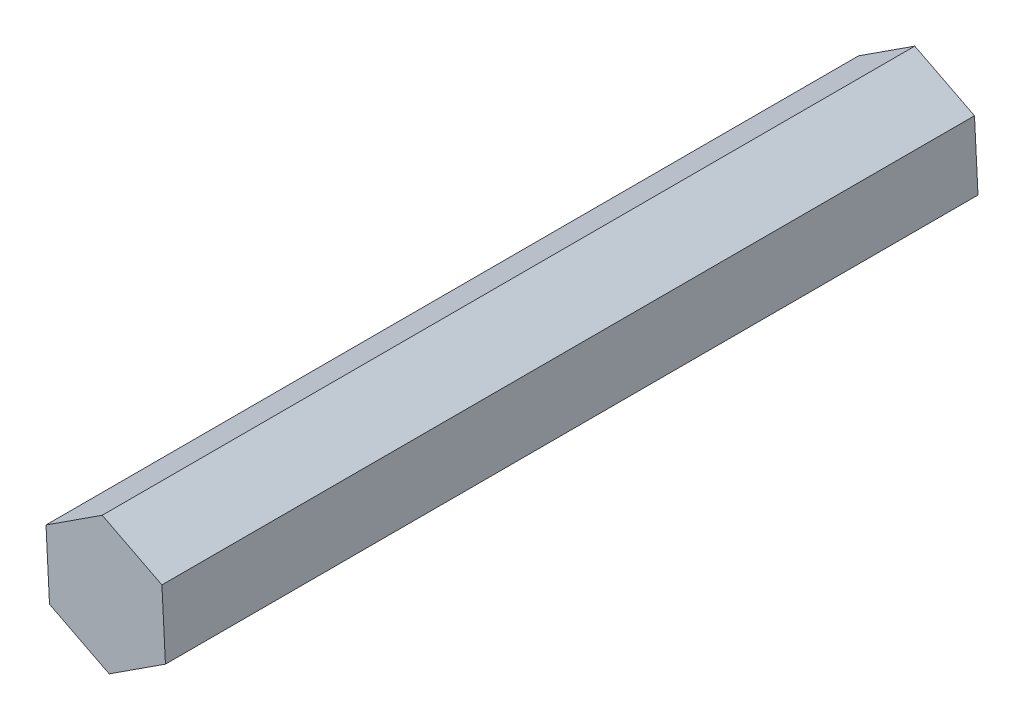
ISO-10303-21;
HEADER;
FILE_DESCRIPTION(('STEP AP214'),'2;1');
FILE_NAME('part.step','',(''),(''),'','','');
FILE_SCHEMA(('AUTOMOTIVE_DESIGN { 1 0 10303 214 1 1 1 1 }'));
ENDSEC;
DATA;
#1=APPLICATION_CONTEXT('core data for automotive mechanical design processes');
#2=APPLICATION_PROTOCOL_DEFINITION('international standard','automotive_design',2000,#1);
#3=PRODUCT_CONTEXT('',#1,'mechanical');
#4=PRODUCT('Part','Part','',(#3));
#5=PRODUCT_RELATED_PRODUCT_CATEGORY('part','',(#4));
#6=PRODUCT_DEFINITION_FORMATION('','',#4);
#7=PRODUCT_DEFINITION_CONTEXT('part definition',#1,'design');
#8=PRODUCT_DEFINITION('design','',#6,#7);
#9=PRODUCT_DEFINITION_SHAPE('','',#8);
#10=(LENGTH_UNIT() NAMED_UNIT(*) SI_UNIT(.MILLI.,.METRE.));
#11=(NAMED_UNIT(*) PLANE_ANGLE_UNIT() SI_UNIT($,.RADIAN.));
#12=(NAMED_UNIT(*) SI_UNIT($,.STERADIAN.) SOLID_ANGLE_UNIT());
#13=UNCERTAINTY_MEASURE_WITH_UNIT(LENGTH_MEASURE(1.E-05),#10,'distance_accuracy_value','');
#14=(GEOMETRIC_REPRESENTATION_CONTEXT(3) GLOBAL_UNCERTAINTY_ASSIGNED_CONTEXT((#13)) GLOBAL_UNIT_ASSIGNED_CONTEXT((#10,
#11,#12)) REPRESENTATION_CONTEXT('',''));
#15=CARTESIAN_POINT('',(0.,0.,0.));
#16=DIRECTION('',(0.,0.,1.));
#17=DIRECTION('',(1.,0.,0.));
#18=AXIS2_PLACEMENT_3D('',#15,#16,#17);
#19=CARTESIAN_POINT('',(-0.383222680415475,7.32232706935087,88.9));
#20=DIRECTION('',(0.544579155708624,-0.838709450982688,0.));
#21=DIRECTION('',(0.838709450982688,0.544579155708624,0.));
#22=AXIS2_PLACEMENT_3D('',#19,#20,#21);
#23=PLANE('',#22);
#24=DIRECTION('',(-0.838709450982688,-0.544579155708624,0.));
#25=VECTOR('',#24,1.);
#26=CARTESIAN_POINT('',(-0.383222680415475,7.32232706935087,0.));
#27=LINE('',#26,#25);
#28=CARTESIAN_POINT('',(-0.383222680415475,7.32232706935087,0.));
#29=VERTEX_POINT('',#28);
#30=CARTESIAN_POINT('',(-6.53293259708405,3.32928295812927,0.));
#31=VERTEX_POINT('',#30);
#32=EDGE_CURVE('E116',#29,#31,#27,.T.);
#33=ORIENTED_EDGE('',*,*,#32,.T.);
#34=DIRECTION('',(0.,0.,-1.));
#35=VECTOR('',#34,1.);
#36=CARTESIAN_POINT('',(-6.53293259708405,3.32928295812927,88.9));
#37=LINE('',#36,#35);
#38=CARTESIAN_POINT('',(-6.53293259708405,3.32928295812927,88.9));
#39=VERTEX_POINT('',#38);
#40=EDGE_CURVE('E11',#39,#31,#37,.T.);
#41=ORIENTED_EDGE('',*,*,#40,.F.);
#42=DIRECTION('',(-0.838709450982688,-0.544579155708624,0.));
#43=VECTOR('',#42,1.);
#44=CARTESIAN_POINT('',(-0.383222680415475,7.32232706935087,88.9));
#45=LINE('',#44,#43);
#46=CARTESIAN_POINT('',(-0.383222680415475,7.32232706935087,88.9));
#47=VERTEX_POINT('',#46);
#48=EDGE_CURVE('E126',#47,#39,#45,.T.);
#49=ORIENTED_EDGE('',*,*,#48,.F.);
#50=DIRECTION('',(0.,0.,-1.));
#51=VECTOR('',#50,1.);
#52=CARTESIAN_POINT('',(-0.383222680415475,7.32232706935087,88.9));
#53=LINE('',#52,#51);
#54=EDGE_CURVE('E112',#47,#29,#53,.T.);
#55=ORIENTED_EDGE('',*,*,#54,.T.);
#56=EDGE_LOOP('',(#33,#41,#49,#55));
#57=FACE_BOUND('',#56,.T.);
#58=ADVANCED_FACE('F32',(#57),#23,.F.);
#59=CARTESIAN_POINT('',(-6.53293259708405,3.32928295812927,88.9));
#60=DIRECTION('',(0.998633268799419,0.0522646577238061,0.));
#61=DIRECTION('',(-0.0522646577238061,0.998633268799419,0.));
#62=AXIS2_PLACEMENT_3D('',#59,#60,#61);
#63=PLANE('',#62);
#64=DIRECTION('',(0.0522646577238061,-0.998633268799419,0.));
#65=VECTOR('',#64,1.);
#66=CARTESIAN_POINT('',(-6.53293259708405,3.32928295812927,0.));
#67=LINE('',#66,#65);
#68=CARTESIAN_POINT('',(-6.14970991666858,-3.9930441112216,0.));
#69=VERTEX_POINT('',#68);
#70=EDGE_CURVE('E119',#31,#69,#67,.T.);
#71=ORIENTED_EDGE('',*,*,#70,.T.);
#72=DIRECTION('',(0.,0.,-1.));
#73=VECTOR('',#72,1.);
#74=CARTESIAN_POINT('',(-6.14970991666858,-3.9930441112216,88.9));
#75=LINE('',#74,#73);
#76=CARTESIAN_POINT('',(-6.14970991666858,-3.9930441112216,88.9));
#77=VERTEX_POINT('',#76);
#78=EDGE_CURVE('E40',#77,#69,#75,.T.);
#79=ORIENTED_EDGE('',*,*,#78,.F.);
#80=DIRECTION('',(0.0522646577238061,-0.998633268799419,0.));
#81=VECTOR('',#80,1.);
#82=CARTESIAN_POINT('',(-6.53293259708405,3.32928295812927,88.9));
#83=LINE('',#82,#81);
#84=EDGE_CURVE('E85',#39,#77,#83,.T.);
#85=ORIENTED_EDGE('',*,*,#84,.F.);
#86=ORIENTED_EDGE('',*,*,#40,.T.);
#87=EDGE_LOOP('',(#71,#79,#85,#86));
#88=FACE_BOUND('',#87,.T.);
#89=ADVANCED_FACE('F150',(#88),#63,.F.);
#90=CARTESIAN_POINT('',(-6.14970991666858,-3.9930441112216,88.9));
#91=DIRECTION('',(0.454054113090795,0.890974108706494,0.));
#92=DIRECTION('',(-0.890974108706494,0.454054113090795,0.));
#93=AXIS2_PLACEMENT_3D('',#90,#91,#92);
#94=PLANE('',#93);
#95=DIRECTION('',(0.890974108706494,-0.454054113090795,0.));
#96=VECTOR('',#95,1.);
#97=CARTESIAN_POINT('',(-6.14970991666858,-3.9930441112216,0.));
#98=LINE('',#97,#96);
#99=CARTESIAN_POINT('',(0.383222680415474,-7.32232706935087,0.));
#100=VERTEX_POINT('',#99);
#101=EDGE_CURVE('E121',#69,#100,#98,.T.);
#102=ORIENTED_EDGE('',*,*,#101,.T.);
#103=DIRECTION('',(0.,0.,-1.));
#104=VECTOR('',#103,1.);
#105=CARTESIAN_POINT('',(0.383222680415474,-7.32232706935087,88.9));
#106=LINE('',#105,#104);
#107=CARTESIAN_POINT('',(0.383222680415474,-7.32232706935087,88.9));
#108=VERTEX_POINT('',#107);
#109=EDGE_CURVE('E107',#108,#100,#106,.T.);
#110=ORIENTED_EDGE('',*,*,#109,.F.);
#111=DIRECTION('',(0.890974108706494,-0.454054113090795,0.));
#112=VECTOR('',#111,1.);
#113=CARTESIAN_POINT('',(-6.14970991666858,-3.9930441112216,88.9));
#114=LINE('',#113,#112);
#115=EDGE_CURVE('E98',#77,#108,#114,.T.);
#116=ORIENTED_EDGE('',*,*,#115,.F.);
#117=ORIENTED_EDGE('',*,*,#78,.T.);
#118=EDGE_LOOP('',(#102,#110,#116,#117));
#119=FACE_BOUND('',#118,.T.);
#120=ADVANCED_FACE('F132',(#119),#94,.F.);
#121=CARTESIAN_POINT('',(0.383222680415474,-7.32232706935087,88.9));
#122=DIRECTION('',(-0.544579155708624,0.838709450982688,0.));
#123=DIRECTION('',(-0.838709450982688,-0.544579155708624,0.));
#124=AXIS2_PLACEMENT_3D('',#121,#122,#123);
#125=PLANE('',#124);
#126=DIRECTION('',(0.838709450982688,0.544579155708624,0.));
#127=VECTOR('',#126,1.);
#128=CARTESIAN_POINT('',(0.383222680415474,-7.32232706935087,0.));
#129=LINE('',#128,#127);
#130=CARTESIAN_POINT('',(6.53293259708405,-3.32928295812927,0.));
#131=VERTEX_POINT('',#130);
#132=EDGE_CURVE('E106',#100,#131,#129,.T.);
#133=ORIENTED_EDGE('',*,*,#132,.T.);
#134=DIRECTION('',(0.,0.,-1.));
#135=VECTOR('',#134,1.);
#136=CARTESIAN_POINT('',(6.53293259708405,-3.32928295812927,88.9));
#137=LINE('',#136,#135);
#138=CARTESIAN_POINT('',(6.53293259708405,-3.32928295812927,88.9));
#139=VERTEX_POINT('',#138);
#140=EDGE_CURVE('E103',#139,#131,#137,.T.);
#141=ORIENTED_EDGE('',*,*,#140,.F.);
#142=DIRECTION('',(0.838709450982688,0.544579155708624,0.));
#143=VECTOR('',#142,1.);
#144=CARTESIAN_POINT('',(0.383222680415474,-7.32232706935087,88.9));
#145=LINE('',#144,#143);
#146=EDGE_CURVE('E92',#108,#139,#145,.T.);
#147=ORIENTED_EDGE('',*,*,#146,.F.);
#148=ORIENTED_EDGE('',*,*,#109,.T.);
#149=EDGE_LOOP('',(#133,#141,#147,#148));
#150=FACE_BOUND('',#149,.T.);
#151=ADVANCED_FACE('F104',(#150),#125,.F.);
#152=CARTESIAN_POINT('',(6.53293259708405,-3.32928295812927,88.9));
#153=DIRECTION('',(-0.998633268799419,-0.0522646577238062,0.));
#154=DIRECTION('',(0.0522646577238062,-0.998633268799419,0.));
#155=AXIS2_PLACEMENT_3D('',#152,#153,#154);
#156=PLANE('',#155);
#157=DIRECTION('',(-0.0522646577238062,0.998633268799419,0.));
#158=VECTOR('',#157,1.);
#159=CARTESIAN_POINT('',(6.53293259708405,-3.32928295812927,0.));
#160=LINE('',#159,#158);
#161=CARTESIAN_POINT('',(6.14970991666857,3.99304411122161,0.));
#162=VERTEX_POINT('',#161);
#163=EDGE_CURVE('E71',#131,#162,#160,.T.);
#164=ORIENTED_EDGE('',*,*,#163,.T.);
#165=DIRECTION('',(0.,0.,-1.));
#166=VECTOR('',#165,1.);
#167=CARTESIAN_POINT('',(6.14970991666857,3.99304411122161,88.9));
#168=LINE('',#167,#166);
#169=CARTESIAN_POINT('',(6.14970991666857,3.99304411122161,88.9));
#170=VERTEX_POINT('',#169);
#171=EDGE_CURVE('E108',#170,#162,#168,.T.);
#172=ORIENTED_EDGE('',*,*,#171,.F.);
#173=DIRECTION('',(-0.0522646577238062,0.998633268799419,0.));
#174=VECTOR('',#173,1.);
#175=CARTESIAN_POINT('',(6.53293259708405,-3.32928295812927,88.9));
#176=LINE('',#175,#174);
#177=EDGE_CURVE('E96',#139,#170,#176,.T.);
#178=ORIENTED_EDGE('',*,*,#177,.F.);
#179=ORIENTED_EDGE('',*,*,#140,.T.);
#180=EDGE_LOOP('',(#164,#172,#178,#179));
#181=FACE_BOUND('',#180,.T.);
#182=ADVANCED_FACE('F110',(#181),#156,.F.);
#183=CARTESIAN_POINT('',(6.14970991666857,3.99304411122161,88.9));
#184=DIRECTION('',(-0.454054113090795,-0.890974108706494,0.));
#185=DIRECTION('',(0.890974108706494,-0.454054113090795,0.));
#186=AXIS2_PLACEMENT_3D('',#183,#184,#185);
#187=PLANE('',#186);
#188=DIRECTION('',(-0.890974108706494,0.454054113090795,0.));
#189=VECTOR('',#188,1.);
#190=CARTESIAN_POINT('',(6.14970991666857,3.99304411122161,0.));
#191=LINE('',#190,#189);
#192=EDGE_CURVE('E77',#162,#29,#191,.T.);
#193=ORIENTED_EDGE('',*,*,#192,.T.);
#194=ORIENTED_EDGE('',*,*,#54,.F.);
#195=DIRECTION('',(-0.890974108706494,0.454054113090795,0.));
#196=VECTOR('',#195,1.);
#197=CARTESIAN_POINT('',(6.14970991666857,3.99304411122161,88.9));
#198=LINE('',#197,#196);
#199=EDGE_CURVE('E48',#170,#47,#198,.T.);
#200=ORIENTED_EDGE('',*,*,#199,.F.);
#201=ORIENTED_EDGE('',*,*,#171,.T.);
#202=EDGE_LOOP('',(#193,#194,#200,#201));
#203=FACE_BOUND('',#202,.T.);
#204=ADVANCED_FACE('F139',(#203),#187,.F.);
#205=CARTESIAN_POINT('',(0.,0.,88.9));
#206=DIRECTION('',(0.,0.,1.));
#207=DIRECTION('',(1.,0.,0.));
#208=AXIS2_PLACEMENT_3D('',#205,#206,#207);
#209=PLANE('',#208);
#210=ORIENTED_EDGE('',*,*,#48,.T.);
#211=ORIENTED_EDGE('',*,*,#84,.T.);
#212=ORIENTED_EDGE('',*,*,#115,.T.);
#213=ORIENTED_EDGE('',*,*,#146,.T.);
#214=ORIENTED_EDGE('',*,*,#177,.T.);
#215=ORIENTED_EDGE('',*,*,#199,.T.);
#216=EDGE_LOOP('',(#210,#211,#212,#213,#214,#215));
#217=FACE_BOUND('',#216,.T.);
#218=ADVANCED_FACE('F94',(#217),#209,.T.);
#219=CARTESIAN_POINT('',(0.,0.,0.));
#220=DIRECTION('',(0.,0.,1.));
#221=DIRECTION('',(1.,0.,0.));
#222=AXIS2_PLACEMENT_3D('',#219,#220,#221);
#223=PLANE('',#222);
#224=ORIENTED_EDGE('',*,*,#32,.F.);
#225=ORIENTED_EDGE('',*,*,#192,.F.);
#226=ORIENTED_EDGE('',*,*,#163,.F.);
#227=ORIENTED_EDGE('',*,*,#132,.F.);
#228=ORIENTED_EDGE('',*,*,#101,.F.);
#229=ORIENTED_EDGE('',*,*,#70,.F.);
#230=EDGE_LOOP('',(#224,#225,#226,#227,#228,#229));
#231=FACE_BOUND('',#230,.T.);
#232=ADVANCED_FACE('F135',(#231),#223,.F.);
#233=CLOSED_SHELL('',(#58,#89,#120,#151,#182,#204,#218,#232));
#234=MANIFOLD_SOLID_BREP('B2',#233);
#235=ADVANCED_BREP_SHAPE_REPRESENTATION('',(#18,#234),#14);
#236=SHAPE_DEFINITION_REPRESENTATION(#9,#235);
ENDSEC;
END-ISO-10303-21;
